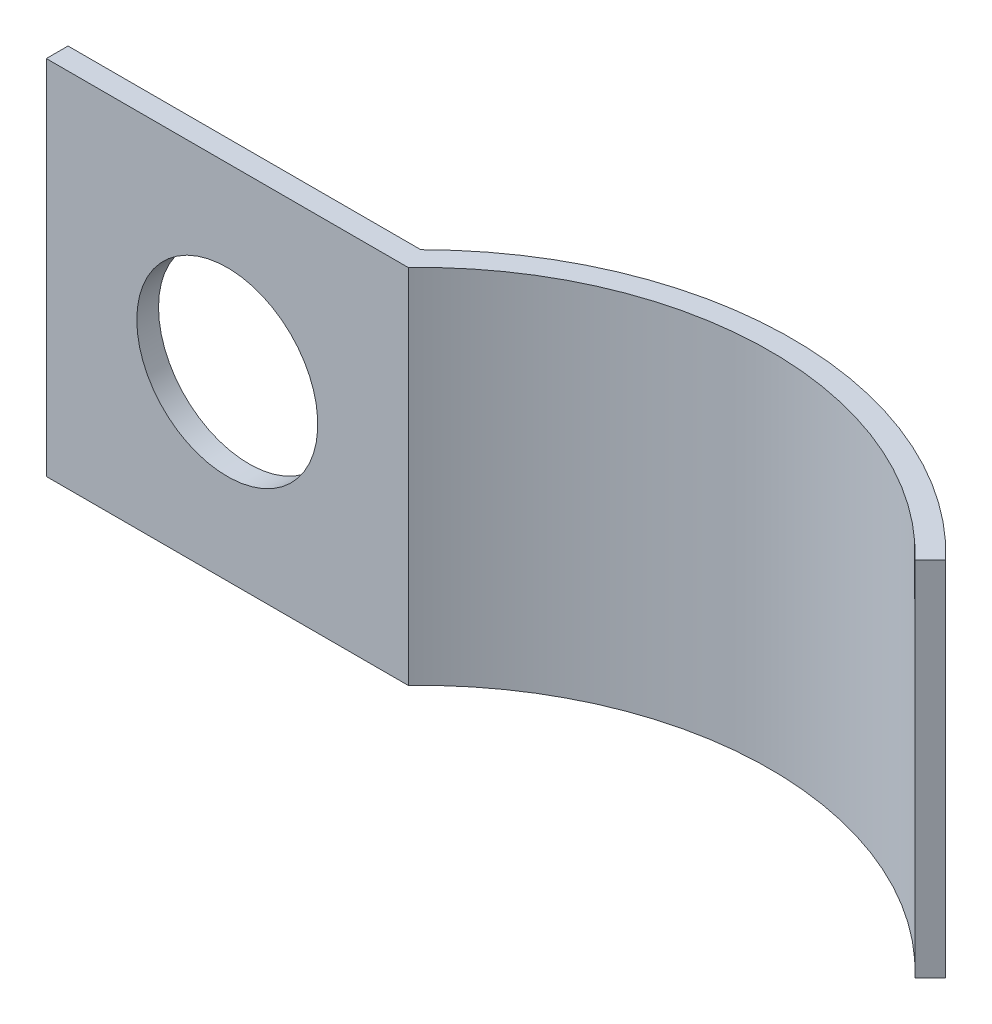
ISO-10303-21;
HEADER;
FILE_DESCRIPTION(('STEP AP214'),'2;1');
FILE_NAME('part.step','',(''),(''),'','','');
FILE_SCHEMA(('AUTOMOTIVE_DESIGN { 1 0 10303 214 1 1 1 1 }'));
ENDSEC;
DATA;
#1=APPLICATION_CONTEXT('core data for automotive mechanical design processes');
#2=APPLICATION_PROTOCOL_DEFINITION('international standard','automotive_design',2000,#1);
#3=PRODUCT_CONTEXT('',#1,'mechanical');
#4=PRODUCT('Part','Part','',(#3));
#5=PRODUCT_RELATED_PRODUCT_CATEGORY('part','',(#4));
#6=PRODUCT_DEFINITION_FORMATION('','',#4);
#7=PRODUCT_DEFINITION_CONTEXT('part definition',#1,'design');
#8=PRODUCT_DEFINITION('design','',#6,#7);
#9=PRODUCT_DEFINITION_SHAPE('','',#8);
#10=(LENGTH_UNIT() NAMED_UNIT(*) SI_UNIT(.MILLI.,.METRE.));
#11=(NAMED_UNIT(*) PLANE_ANGLE_UNIT() SI_UNIT($,.RADIAN.));
#12=(NAMED_UNIT(*) SI_UNIT($,.STERADIAN.) SOLID_ANGLE_UNIT());
#13=UNCERTAINTY_MEASURE_WITH_UNIT(LENGTH_MEASURE(1.E-05),#10,'distance_accuracy_value','');
#14=(GEOMETRIC_REPRESENTATION_CONTEXT(3) GLOBAL_UNCERTAINTY_ASSIGNED_CONTEXT((#13)) GLOBAL_UNIT_ASSIGNED_CONTEXT((#10,
#11,#12)) REPRESENTATION_CONTEXT('',''));
#15=CARTESIAN_POINT('',(0.,0.,0.));
#16=DIRECTION('',(0.,0.,1.));
#17=DIRECTION('',(1.,0.,0.));
#18=AXIS2_PLACEMENT_3D('',#15,#16,#17);
#19=CARTESIAN_POINT('',(0.,5.,0.));
#20=DIRECTION('',(1.,0.,0.));
#21=DIRECTION('',(0.,0.,-1.));
#22=AXIS2_PLACEMENT_3D('',#19,#20,#21);
#23=PLANE('',#22);
#24=DIRECTION('',(0.,0.,1.));
#25=VECTOR('',#24,1.);
#26=CARTESIAN_POINT('',(0.,0.,0.));
#27=LINE('',#26,#25);
#28=CARTESIAN_POINT('',(0.,0.,-0.3));
#29=VERTEX_POINT('',#28);
#30=CARTESIAN_POINT('',(0.,0.,0.));
#31=VERTEX_POINT('',#30);
#32=EDGE_CURVE('E132',#29,#31,#27,.T.);
#33=ORIENTED_EDGE('',*,*,#32,.T.);
#34=DIRECTION('',(0.,-1.,0.));
#35=VECTOR('',#34,1.);
#36=CARTESIAN_POINT('',(0.,5.,0.));
#37=LINE('',#36,#35);
#38=CARTESIAN_POINT('',(0.,5.,0.));
#39=VERTEX_POINT('',#38);
#40=EDGE_CURVE('E11',#39,#31,#37,.T.);
#41=ORIENTED_EDGE('',*,*,#40,.F.);
#42=DIRECTION('',(0.,0.,1.));
#43=VECTOR('',#42,1.);
#44=CARTESIAN_POINT('',(0.,5.,0.));
#45=LINE('',#44,#43);
#46=CARTESIAN_POINT('',(0.,5.,-0.3));
#47=VERTEX_POINT('',#46);
#48=EDGE_CURVE('E149',#47,#39,#45,.T.);
#49=ORIENTED_EDGE('',*,*,#48,.F.);
#50=DIRECTION('',(0.,-1.,0.));
#51=VECTOR('',#50,1.);
#52=CARTESIAN_POINT('',(0.,5.,-0.3));
#53=LINE('',#52,#51);
#54=EDGE_CURVE('E128',#47,#29,#53,.T.);
#55=ORIENTED_EDGE('',*,*,#54,.T.);
#56=EDGE_LOOP('',(#33,#41,#49,#55));
#57=FACE_BOUND('',#56,.T.);
#58=ADVANCED_FACE('F42',(#57),#23,.F.);
#59=CARTESIAN_POINT('',(0.,5.,0.));
#60=DIRECTION('',(0.,0.,-1.));
#61=DIRECTION('',(-1.,0.,0.));
#62=AXIS2_PLACEMENT_3D('',#59,#60,#61);
#63=PLANE('',#62);
#64=CARTESIAN_POINT('',(2.5,2.5,0.));
#65=DIRECTION('',(0.,0.,-1.));
#66=DIRECTION('',(-1.,0.,0.));
#67=AXIS2_PLACEMENT_3D('',#64,#65,#66);
#68=CIRCLE('',#67,1.25);
#69=CARTESIAN_POINT('',(1.25,2.5,0.));
#70=VERTEX_POINT('',#69);
#71=EDGE_CURVE('E137',#70,#70,#68,.T.);
#72=ORIENTED_EDGE('',*,*,#71,.T.);
#73=EDGE_LOOP('',(#72));
#74=FACE_BOUND('',#73,.T.);
#75=DIRECTION('',(1.,0.,0.));
#76=VECTOR('',#75,1.);
#77=CARTESIAN_POINT('',(0.,0.,0.));
#78=LINE('',#77,#76);
#79=CARTESIAN_POINT('',(5.,0.,0.));
#80=VERTEX_POINT('',#79);
#81=EDGE_CURVE('E136',#31,#80,#78,.T.);
#82=ORIENTED_EDGE('',*,*,#81,.T.);
#83=DIRECTION('',(0.,-1.,0.));
#84=VECTOR('',#83,1.);
#85=CARTESIAN_POINT('',(5.,5.,0.));
#86=LINE('',#85,#84);
#87=CARTESIAN_POINT('',(5.,5.,0.));
#88=VERTEX_POINT('',#87);
#89=EDGE_CURVE('E51',#88,#80,#86,.T.);
#90=ORIENTED_EDGE('',*,*,#89,.F.);
#91=DIRECTION('',(1.,0.,0.));
#92=VECTOR('',#91,1.);
#93=CARTESIAN_POINT('',(0.,5.,0.));
#94=LINE('',#93,#92);
#95=EDGE_CURVE('E96',#39,#88,#94,.T.);
#96=ORIENTED_EDGE('',*,*,#95,.F.);
#97=ORIENTED_EDGE('',*,*,#40,.T.);
#98=EDGE_LOOP('',(#82,#90,#96,#97));
#99=FACE_BOUND('',#98,.T.);
#100=ADVANCED_FACE('F180',(#74,#99),#63,.F.);
#101=CARTESIAN_POINT('',(8.5,5.,3.33333333333334));
#102=DIRECTION('',(0.,-1.,0.));
#103=DIRECTION('',(0.,0.,-1.));
#104=AXIS2_PLACEMENT_3D('',#101,#102,#103);
#105=CYLINDRICAL_SURFACE('',#104,4.83333333333334);
#106=CARTESIAN_POINT('',(8.5,0.,3.33333333333334));
#107=DIRECTION('',(0.,-1.,0.));
#108=DIRECTION('',(0.,0.,-1.));
#109=AXIS2_PLACEMENT_3D('',#106,#107,#108);
#110=CIRCLE('',#109,4.83333333333334);
#111=CARTESIAN_POINT('',(12.,0.,0.));
#112=VERTEX_POINT('',#111);
#113=EDGE_CURVE('E140',#80,#112,#110,.T.);
#114=ORIENTED_EDGE('',*,*,#113,.T.);
#115=DIRECTION('',(0.,-1.,0.));
#116=VECTOR('',#115,1.);
#117=CARTESIAN_POINT('',(12.,5.,0.));
#118=LINE('',#117,#116);
#119=CARTESIAN_POINT('',(12.,5.,0.));
#120=VERTEX_POINT('',#119);
#121=EDGE_CURVE('E120',#120,#112,#118,.T.);
#122=ORIENTED_EDGE('',*,*,#121,.F.);
#123=CARTESIAN_POINT('',(8.5,5.,3.33333333333334));
#124=DIRECTION('',(0.,-1.,0.));
#125=DIRECTION('',(0.,0.,-1.));
#126=AXIS2_PLACEMENT_3D('',#123,#124,#125);
#127=CIRCLE('',#126,4.83333333333334);
#128=EDGE_CURVE('E109',#88,#120,#127,.T.);
#129=ORIENTED_EDGE('',*,*,#128,.F.);
#130=ORIENTED_EDGE('',*,*,#89,.T.);
#131=EDGE_LOOP('',(#114,#122,#129,#130));
#132=FACE_BOUND('',#131,.T.);
#133=ADVANCED_FACE('F160',(#132),#105,.F.);
#134=CARTESIAN_POINT('',(12.2121914334953,5.,-0.212191433495291));
#135=DIRECTION('',(-0.707106781186525,0.,-0.70710678118657));
#136=DIRECTION('',(-0.70710678118657,0.,0.707106781186525));
#137=AXIS2_PLACEMENT_3D('',#134,#135,#136);
#138=PLANE('',#137);
#139=DIRECTION('',(0.70710678118657,0.,-0.707106781186525));
#140=VECTOR('',#139,1.);
#141=CARTESIAN_POINT('',(12.2121914334953,0.,-0.212191433495291));
#142=LINE('',#141,#140);
#143=CARTESIAN_POINT('',(12.2121914334953,0.,-0.212191433495291));
#144=VERTEX_POINT('',#143);
#145=EDGE_CURVE('E118',#112,#144,#142,.T.);
#146=ORIENTED_EDGE('',*,*,#145,.T.);
#147=DIRECTION('',(0.,-1.,0.));
#148=VECTOR('',#147,1.);
#149=CARTESIAN_POINT('',(12.2121914334953,5.,-0.212191433495291));
#150=LINE('',#149,#148);
#151=CARTESIAN_POINT('',(12.2121914334953,5.,-0.212191433495291));
#152=VERTEX_POINT('',#151);
#153=EDGE_CURVE('E115',#152,#144,#150,.T.);
#154=ORIENTED_EDGE('',*,*,#153,.F.);
#155=DIRECTION('',(0.70710678118657,0.,-0.707106781186525));
#156=VECTOR('',#155,1.);
#157=CARTESIAN_POINT('',(12.2121914334953,5.,-0.212191433495291));
#158=LINE('',#157,#156);
#159=EDGE_CURVE('E103',#120,#152,#158,.T.);
#160=ORIENTED_EDGE('',*,*,#159,.F.);
#161=ORIENTED_EDGE('',*,*,#121,.T.);
#162=EDGE_LOOP('',(#146,#154,#160,#161));
#163=FACE_BOUND('',#162,.T.);
#164=ADVANCED_FACE('F116',(#163),#138,.F.);
#165=CARTESIAN_POINT('',(8.5,5.,3.33333333333334));
#166=DIRECTION('',(0.,-1.,0.));
#167=DIRECTION('',(0.,0.,-1.));
#168=AXIS2_PLACEMENT_3D('',#165,#166,#167);
#169=CYLINDRICAL_SURFACE('',#168,5.13333333333334);
#170=CARTESIAN_POINT('',(8.5,0.,3.33333333333334));
#171=DIRECTION('',(0.,1.,0.));
#172=DIRECTION('',(0.,0.,-1.));
#173=AXIS2_PLACEMENT_3D('',#170,#171,#172);
#174=CIRCLE('',#173,5.13333333333334);
#175=CARTESIAN_POINT('',(4.87370712710625,0.,-0.299999999999999));
#176=VERTEX_POINT('',#175);
#177=EDGE_CURVE('E82',#144,#176,#174,.T.);
#178=ORIENTED_EDGE('',*,*,#177,.T.);
#179=DIRECTION('',(0.,-1.,0.));
#180=VECTOR('',#179,1.);
#181=CARTESIAN_POINT('',(4.87370712710625,5.,-0.299999999999999));
#182=LINE('',#181,#180);
#183=CARTESIAN_POINT('',(4.87370712710625,5.,-0.299999999999999));
#184=VERTEX_POINT('',#183);
#185=EDGE_CURVE('E121',#184,#176,#182,.T.);
#186=ORIENTED_EDGE('',*,*,#185,.F.);
#187=CARTESIAN_POINT('',(8.5,5.,3.33333333333334));
#188=DIRECTION('',(0.,1.,0.));
#189=DIRECTION('',(0.,0.,-1.));
#190=AXIS2_PLACEMENT_3D('',#187,#188,#189);
#191=CIRCLE('',#190,5.13333333333334);
#192=EDGE_CURVE('E107',#152,#184,#191,.T.);
#193=ORIENTED_EDGE('',*,*,#192,.F.);
#194=ORIENTED_EDGE('',*,*,#153,.T.);
#195=EDGE_LOOP('',(#178,#186,#193,#194));
#196=FACE_BOUND('',#195,.T.);
#197=ADVANCED_FACE('F123',(#196),#169,.T.);
#198=CARTESIAN_POINT('',(0.,5.,-0.3));
#199=DIRECTION('',(0.,0.,1.));
#200=DIRECTION('',(1.,0.,0.));
#201=AXIS2_PLACEMENT_3D('',#198,#199,#200);
#202=PLANE('',#201);
#203=CARTESIAN_POINT('',(2.5,2.5,-0.3));
#204=DIRECTION('',(0.,0.,-1.));
#205=DIRECTION('',(-1.,0.,0.));
#206=AXIS2_PLACEMENT_3D('',#203,#204,#205);
#207=CIRCLE('',#206,1.25);
#208=CARTESIAN_POINT('',(1.25,2.5,-0.3));
#209=VERTEX_POINT('',#208);
#210=EDGE_CURVE('E283',#209,#209,#207,.T.);
#211=ORIENTED_EDGE('',*,*,#210,.F.);
#212=EDGE_LOOP('',(#211));
#213=FACE_BOUND('',#212,.T.);
#214=DIRECTION('',(-1.,0.,0.));
#215=VECTOR('',#214,1.);
#216=CARTESIAN_POINT('',(0.,0.,-0.3));
#217=LINE('',#216,#215);
#218=EDGE_CURVE('E88',#176,#29,#217,.T.);
#219=ORIENTED_EDGE('',*,*,#218,.T.);
#220=ORIENTED_EDGE('',*,*,#54,.F.);
#221=DIRECTION('',(-1.,0.,0.));
#222=VECTOR('',#221,1.);
#223=CARTESIAN_POINT('',(0.,5.,-0.3));
#224=LINE('',#223,#222);
#225=EDGE_CURVE('E59',#184,#47,#224,.T.);
#226=ORIENTED_EDGE('',*,*,#225,.F.);
#227=ORIENTED_EDGE('',*,*,#185,.T.);
#228=EDGE_LOOP('',(#219,#220,#226,#227));
#229=FACE_BOUND('',#228,.T.);
#230=ADVANCED_FACE('F167',(#213,#229),#202,.F.);
#231=CARTESIAN_POINT('',(8.5,5.,3.33333333333334));
#232=DIRECTION('',(0.,-1.,0.));
#233=DIRECTION('',(0.,0.,-1.));
#234=AXIS2_PLACEMENT_3D('',#231,#232,#233);
#235=PLANE('',#234);
#236=ORIENTED_EDGE('',*,*,#48,.T.);
#237=ORIENTED_EDGE('',*,*,#95,.T.);
#238=ORIENTED_EDGE('',*,*,#128,.T.);
#239=ORIENTED_EDGE('',*,*,#159,.T.);
#240=ORIENTED_EDGE('',*,*,#192,.T.);
#241=ORIENTED_EDGE('',*,*,#225,.T.);
#242=EDGE_LOOP('',(#236,#237,#238,#239,#240,#241));
#243=FACE_BOUND('',#242,.T.);
#244=ADVANCED_FACE('F105',(#243),#235,.F.);
#245=CARTESIAN_POINT('',(8.5,0.,3.33333333333334));
#246=DIRECTION('',(0.,-1.,0.));
#247=DIRECTION('',(0.,0.,-1.));
#248=AXIS2_PLACEMENT_3D('',#245,#246,#247);
#249=PLANE('',#248);
#250=ORIENTED_EDGE('',*,*,#32,.F.);
#251=ORIENTED_EDGE('',*,*,#218,.F.);
#252=ORIENTED_EDGE('',*,*,#177,.F.);
#253=ORIENTED_EDGE('',*,*,#145,.F.);
#254=ORIENTED_EDGE('',*,*,#113,.F.);
#255=ORIENTED_EDGE('',*,*,#81,.F.);
#256=EDGE_LOOP('',(#250,#251,#252,#253,#254,#255));
#257=FACE_BOUND('',#256,.T.);
#258=ADVANCED_FACE('F163',(#257),#249,.T.);
#259=CARTESIAN_POINT('',(2.5,2.5,4.7));
#260=DIRECTION('',(0.,0.,-1.));
#261=DIRECTION('',(-1.,0.,0.));
#262=AXIS2_PLACEMENT_3D('',#259,#260,#261);
#263=CYLINDRICAL_SURFACE('',#262,1.25);
#264=ORIENTED_EDGE('',*,*,#210,.T.);
#265=EDGE_LOOP('',(#264));
#266=FACE_BOUND('',#265,.T.);
#267=ORIENTED_EDGE('',*,*,#71,.F.);
#268=EDGE_LOOP('',(#267));
#269=FACE_BOUND('',#268,.T.);
#270=ADVANCED_FACE('F221',(#266,#269),#263,.F.);
#271=CLOSED_SHELL('',(#58,#100,#133,#164,#197,#230,#244,#258,#270));
#272=MANIFOLD_SOLID_BREP('B2',#271);
#273=ADVANCED_BREP_SHAPE_REPRESENTATION('',(#18,#272),#14);
#274=SHAPE_DEFINITION_REPRESENTATION(#9,#273);
ENDSEC;
END-ISO-10303-21;
